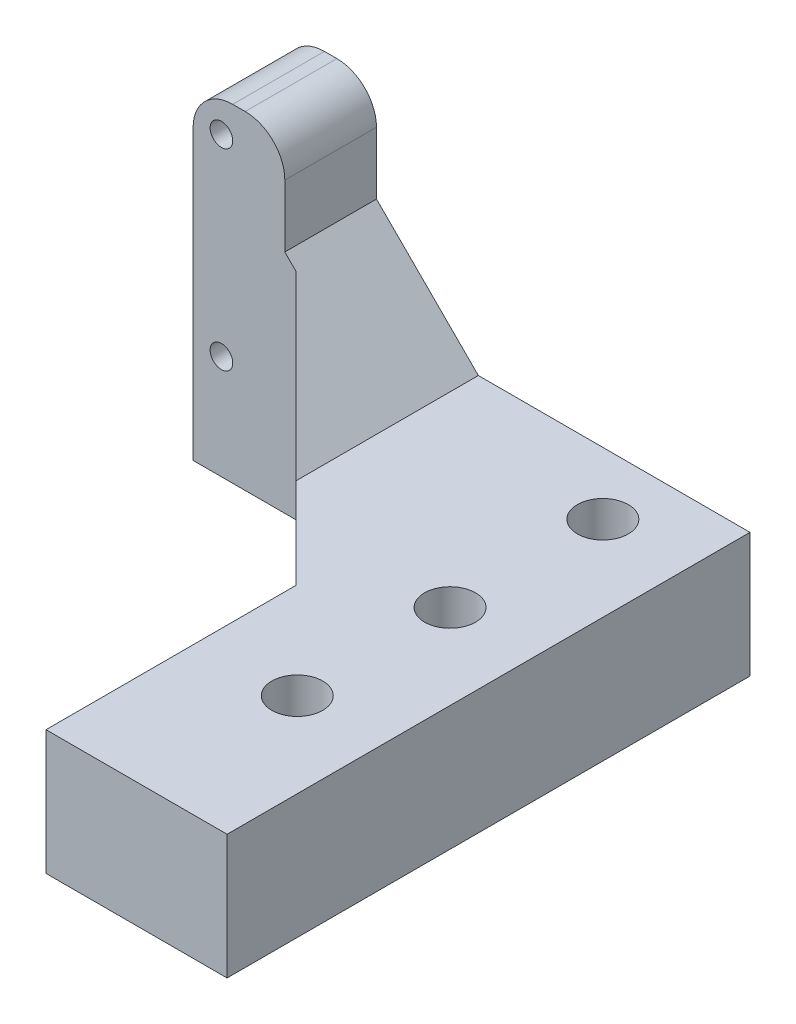
ISO-10303-21;
HEADER;
FILE_DESCRIPTION(('STEP AP214'),'2;1');
FILE_NAME('part.step','',(''),(''),'','','');
FILE_SCHEMA(('AUTOMOTIVE_DESIGN { 1 0 10303 214 1 1 1 1 }'));
ENDSEC;
DATA;
#1=APPLICATION_CONTEXT('core data for automotive mechanical design processes');
#2=APPLICATION_PROTOCOL_DEFINITION('international standard','automotive_design',2000,#1);
#3=PRODUCT_CONTEXT('',#1,'mechanical');
#4=PRODUCT('Part','Part','',(#3));
#5=PRODUCT_RELATED_PRODUCT_CATEGORY('part','',(#4));
#6=PRODUCT_DEFINITION_FORMATION('','',#4);
#7=PRODUCT_DEFINITION_CONTEXT('part definition',#1,'design');
#8=PRODUCT_DEFINITION('design','',#6,#7);
#9=PRODUCT_DEFINITION_SHAPE('','',#8);
#10=(LENGTH_UNIT() NAMED_UNIT(*) SI_UNIT(.MILLI.,.METRE.));
#11=(NAMED_UNIT(*) PLANE_ANGLE_UNIT() SI_UNIT($,.RADIAN.));
#12=(NAMED_UNIT(*) SI_UNIT($,.STERADIAN.) SOLID_ANGLE_UNIT());
#13=UNCERTAINTY_MEASURE_WITH_UNIT(LENGTH_MEASURE(1.E-05),#10,'distance_accuracy_value','');
#14=(GEOMETRIC_REPRESENTATION_CONTEXT(3) GLOBAL_UNCERTAINTY_ASSIGNED_CONTEXT((#13)) GLOBAL_UNIT_ASSIGNED_CONTEXT((#10,
#11,#12)) REPRESENTATION_CONTEXT('',''));
#15=CARTESIAN_POINT('',(0.,0.,0.));
#16=DIRECTION('',(0.,0.,1.));
#17=DIRECTION('',(1.,0.,0.));
#18=AXIS2_PLACEMENT_3D('',#15,#16,#17);
#19=CARTESIAN_POINT('',(0.,0.,46.2));
#20=DIRECTION('',(0.,1.,0.));
#21=DIRECTION('',(0.,0.,1.));
#22=AXIS2_PLACEMENT_3D('',#19,#20,#21);
#23=PLANE('',#22);
#24=DIRECTION('',(1.,0.,0.));
#25=VECTOR('',#24,1.);
#26=CARTESIAN_POINT('',(0.,0.,46.2));
#27=LINE('',#26,#25);
#28=CARTESIAN_POINT('',(25.1,0.,46.2));
#29=VERTEX_POINT('',#28);
#30=CARTESIAN_POINT('',(41.1,0.,46.2));
#31=VERTEX_POINT('',#30);
#32=EDGE_CURVE('E134',#29,#31,#27,.T.);
#33=ORIENTED_EDGE('',*,*,#32,.F.);
#34=DIRECTION('',(0.,0.,-1.));
#35=VECTOR('',#34,1.);
#36=CARTESIAN_POINT('',(25.1,0.,46.2));
#37=LINE('',#36,#35);
#38=CARTESIAN_POINT('',(25.1,0.,24.1));
#39=VERTEX_POINT('',#38);
#40=EDGE_CURVE('E120',#29,#39,#37,.T.);
#41=ORIENTED_EDGE('',*,*,#40,.T.);
#42=DIRECTION('',(0.707106781186551,0.,0.707106781186544));
#43=VECTOR('',#42,1.);
#44=CARTESIAN_POINT('',(23.5999999999999,0.,22.5999999999998));
#45=LINE('',#44,#43);
#46=CARTESIAN_POINT('',(9.09999999999989,0.,8.1));
#47=VERTEX_POINT('',#46);
#48=EDGE_CURVE('E11',#39,#47,#45,.F.);
#49=ORIENTED_EDGE('',*,*,#48,.T.);
#50=DIRECTION('',(-1.,0.,0.));
#51=VECTOR('',#50,1.);
#52=CARTESIAN_POINT('',(0.,0.,8.1));
#53=LINE('',#52,#51);
#54=CARTESIAN_POINT('',(0.,0.,8.1));
#55=VERTEX_POINT('',#54);
#56=EDGE_CURVE('E196',#47,#55,#53,.T.);
#57=ORIENTED_EDGE('',*,*,#56,.T.);
#58=DIRECTION('',(0.,0.,-1.));
#59=VECTOR('',#58,1.);
#60=CARTESIAN_POINT('',(0.,0.,46.2));
#61=LINE('',#60,#59);
#62=CARTESIAN_POINT('',(0.,0.,0.));
#63=VERTEX_POINT('',#62);
#64=EDGE_CURVE('E224',#55,#63,#61,.T.);
#65=ORIENTED_EDGE('',*,*,#64,.T.);
#66=DIRECTION('',(-1.,0.,0.));
#67=VECTOR('',#66,1.);
#68=CARTESIAN_POINT('',(18.,0.,0.));
#69=LINE('',#68,#67);
#70=CARTESIAN_POINT('',(41.1,0.,0.));
#71=VERTEX_POINT('',#70);
#72=EDGE_CURVE('E144',#71,#63,#69,.T.);
#73=ORIENTED_EDGE('',*,*,#72,.F.);
#74=DIRECTION('',(0.,0.,-1.));
#75=VECTOR('',#74,1.);
#76=CARTESIAN_POINT('',(41.1,0.,46.2));
#77=LINE('',#76,#75);
#78=EDGE_CURVE('E142',#31,#71,#77,.T.);
#79=ORIENTED_EDGE('',*,*,#78,.F.);
#80=EDGE_LOOP('',(#33,#41,#49,#57,#65,#73,#79));
#81=FACE_BOUND('',#80,.T.);
#82=CARTESIAN_POINT('',(33.6,0.,19.));
#83=DIRECTION('',(0.,1.,0.));
#84=DIRECTION('',(0.,0.,1.));
#85=AXIS2_PLACEMENT_3D('',#82,#83,#84);
#86=CIRCLE('',#85,2.25);
#87=CARTESIAN_POINT('',(33.6,0.,21.25));
#88=VERTEX_POINT('',#87);
#89=EDGE_CURVE('E328',#88,#88,#86,.T.);
#90=ORIENTED_EDGE('',*,*,#89,.T.);
#91=EDGE_LOOP('',(#90));
#92=FACE_BOUND('',#91,.T.);
#93=CARTESIAN_POINT('',(33.6,0.,32.5));
#94=DIRECTION('',(0.,1.,0.));
#95=DIRECTION('',(0.,0.,1.));
#96=AXIS2_PLACEMENT_3D('',#93,#94,#95);
#97=CIRCLE('',#96,2.25);
#98=CARTESIAN_POINT('',(33.6,0.,34.75));
#99=VERTEX_POINT('',#98);
#100=EDGE_CURVE('E336',#99,#99,#97,.T.);
#101=ORIENTED_EDGE('',*,*,#100,.T.);
#102=EDGE_LOOP('',(#101));
#103=FACE_BOUND('',#102,.T.);
#104=CARTESIAN_POINT('',(33.6,0.,5.5));
#105=DIRECTION('',(0.,1.,0.));
#106=DIRECTION('',(0.,0.,1.));
#107=AXIS2_PLACEMENT_3D('',#104,#105,#106);
#108=CIRCLE('',#107,2.25);
#109=CARTESIAN_POINT('',(33.6,0.,7.75));
#110=VERTEX_POINT('',#109);
#111=EDGE_CURVE('E295',#110,#110,#108,.T.);
#112=ORIENTED_EDGE('',*,*,#111,.T.);
#113=EDGE_LOOP('',(#112));
#114=FACE_BOUND('',#113,.T.);
#115=ADVANCED_FACE('F33',(#81,#92,#103,#114),#23,.F.);
#116=CARTESIAN_POINT('',(0.,29.,46.2));
#117=DIRECTION('',(0.,-1.,0.));
#118=DIRECTION('',(0.,0.,-1.));
#119=AXIS2_PLACEMENT_3D('',#116,#117,#118);
#120=PLANE('',#119);
#121=DIRECTION('',(-1.,0.,0.));
#122=VECTOR('',#121,1.);
#123=CARTESIAN_POINT('',(0.,29.,8.1));
#124=LINE('',#123,#122);
#125=CARTESIAN_POINT('',(4.6,29.,8.1));
#126=VERTEX_POINT('',#125);
#127=CARTESIAN_POINT('',(3.5,29.,8.1));
#128=VERTEX_POINT('',#127);
#129=EDGE_CURVE('E204',#126,#128,#124,.T.);
#130=ORIENTED_EDGE('',*,*,#129,.F.);
#131=DIRECTION('',(0.,0.,-1.));
#132=VECTOR('',#131,1.);
#133=CARTESIAN_POINT('',(4.6,29.,46.2));
#134=LINE('',#133,#132);
#135=CARTESIAN_POINT('',(4.6,29.,0.));
#136=VERTEX_POINT('',#135);
#137=EDGE_CURVE('E172',#126,#136,#134,.T.);
#138=ORIENTED_EDGE('',*,*,#137,.T.);
#139=DIRECTION('',(-1.,0.,0.));
#140=VECTOR('',#139,1.);
#141=CARTESIAN_POINT('',(18.,29.,0.));
#142=LINE('',#141,#140);
#143=CARTESIAN_POINT('',(3.5,29.,0.));
#144=VERTEX_POINT('',#143);
#145=EDGE_CURVE('E150',#136,#144,#142,.T.);
#146=ORIENTED_EDGE('',*,*,#145,.T.);
#147=DIRECTION('',(0.,0.,-1.));
#148=VECTOR('',#147,1.);
#149=CARTESIAN_POINT('',(3.5,29.,46.2));
#150=LINE('',#149,#148);
#151=EDGE_CURVE('E143',#144,#128,#150,.F.);
#152=ORIENTED_EDGE('',*,*,#151,.T.);
#153=EDGE_LOOP('',(#130,#138,#146,#152));
#154=FACE_BOUND('',#153,.T.);
#155=ADVANCED_FACE('F247',(#154),#120,.F.);
#156=CARTESIAN_POINT('',(0.,0.,46.2));
#157=DIRECTION('',(0.,0.,-1.));
#158=DIRECTION('',(-1.,0.,0.));
#159=AXIS2_PLACEMENT_3D('',#156,#157,#158);
#160=PLANE('',#159);
#161=DIRECTION('',(-1.,0.,0.));
#162=VECTOR('',#161,1.);
#163=CARTESIAN_POINT('',(26.1,11.,46.2));
#164=LINE('',#163,#162);
#165=CARTESIAN_POINT('',(41.1,11.,46.2));
#166=VERTEX_POINT('',#165);
#167=CARTESIAN_POINT('',(25.1,11.,46.2));
#168=VERTEX_POINT('',#167);
#169=EDGE_CURVE('E136',#166,#168,#164,.T.);
#170=ORIENTED_EDGE('',*,*,#169,.T.);
#171=DIRECTION('',(0.,1.,0.));
#172=VECTOR('',#171,1.);
#173=CARTESIAN_POINT('',(25.1,0.,46.2));
#174=LINE('',#173,#172);
#175=EDGE_CURVE('E123',#29,#168,#174,.T.);
#176=ORIENTED_EDGE('',*,*,#175,.F.);
#177=ORIENTED_EDGE('',*,*,#32,.T.);
#178=DIRECTION('',(0.,1.,0.));
#179=VECTOR('',#178,1.);
#180=CARTESIAN_POINT('',(41.1,0.,46.2));
#181=LINE('',#180,#179);
#182=EDGE_CURVE('E289',#31,#166,#181,.T.);
#183=ORIENTED_EDGE('',*,*,#182,.T.);
#184=EDGE_LOOP('',(#170,#176,#177,#183));
#185=FACE_BOUND('',#184,.T.);
#186=ADVANCED_FACE('F132',(#185),#160,.F.);
#187=CARTESIAN_POINT('',(18.,0.,0.));
#188=DIRECTION('',(0.,0.,-1.));
#189=DIRECTION('',(-1.,0.,0.));
#190=AXIS2_PLACEMENT_3D('',#187,#188,#189);
#191=PLANE('',#190);
#192=ORIENTED_EDGE('',*,*,#145,.F.);
#193=CARTESIAN_POINT('',(4.6,25.5,0.));
#194=DIRECTION('',(0.,0.,-1.));
#195=DIRECTION('',(-1.,0.,0.));
#196=AXIS2_PLACEMENT_3D('',#193,#194,#195);
#197=CIRCLE('',#196,3.5);
#198=CARTESIAN_POINT('',(8.1,25.5,0.));
#199=VERTEX_POINT('',#198);
#200=EDGE_CURVE('E175',#136,#199,#197,.T.);
#201=ORIENTED_EDGE('',*,*,#200,.T.);
#202=DIRECTION('',(0.,1.,0.));
#203=VECTOR('',#202,1.);
#204=CARTESIAN_POINT('',(8.1,29.,0.));
#205=LINE('',#204,#203);
#206=CARTESIAN_POINT('',(8.1,20.0000000000001,0.));
#207=VERTEX_POINT('',#206);
#208=EDGE_CURVE('E210',#207,#199,#205,.T.);
#209=ORIENTED_EDGE('',*,*,#208,.F.);
#210=DIRECTION('',(-0.707106781186544,0.707106781186551,0.));
#211=VECTOR('',#210,1.);
#212=CARTESIAN_POINT('',(8.1,20.0000000000001,0.));
#213=LINE('',#212,#211);
#214=CARTESIAN_POINT('',(17.1,11.,0.));
#215=VERTEX_POINT('',#214);
#216=EDGE_CURVE('E168',#207,#215,#213,.F.);
#217=ORIENTED_EDGE('',*,*,#216,.T.);
#218=DIRECTION('',(-1.,0.,0.));
#219=VECTOR('',#218,1.);
#220=CARTESIAN_POINT('',(26.1,11.,0.));
#221=LINE('',#220,#219);
#222=CARTESIAN_POINT('',(41.1,11.,0.));
#223=VERTEX_POINT('',#222);
#224=EDGE_CURVE('E285',#223,#215,#221,.T.);
#225=ORIENTED_EDGE('',*,*,#224,.F.);
#226=DIRECTION('',(0.,1.,0.));
#227=VECTOR('',#226,1.);
#228=CARTESIAN_POINT('',(41.1,0.,0.));
#229=LINE('',#228,#227);
#230=EDGE_CURVE('E282',#71,#223,#229,.T.);
#231=ORIENTED_EDGE('',*,*,#230,.F.);
#232=ORIENTED_EDGE('',*,*,#72,.T.);
#233=DIRECTION('',(0.,-1.,0.));
#234=VECTOR('',#233,1.);
#235=CARTESIAN_POINT('',(0.,0.,0.));
#236=LINE('',#235,#234);
#237=CARTESIAN_POINT('',(0.,25.5,0.));
#238=VERTEX_POINT('',#237);
#239=EDGE_CURVE('E222',#238,#63,#236,.T.);
#240=ORIENTED_EDGE('',*,*,#239,.F.);
#241=CARTESIAN_POINT('',(3.5,25.5,0.));
#242=DIRECTION('',(0.,0.,-1.));
#243=DIRECTION('',(-1.,0.,0.));
#244=AXIS2_PLACEMENT_3D('',#241,#242,#243);
#245=CIRCLE('',#244,3.5);
#246=EDGE_CURVE('E156',#238,#144,#245,.T.);
#247=ORIENTED_EDGE('',*,*,#246,.T.);
#248=EDGE_LOOP('',(#192,#201,#209,#217,#225,#231,#232,#240,#247));
#249=FACE_BOUND('',#248,.T.);
#250=CARTESIAN_POINT('',(2.5,9.2,0.));
#251=DIRECTION('',(0.,0.,1.));
#252=DIRECTION('',(1.,0.,0.));
#253=AXIS2_PLACEMENT_3D('',#250,#251,#252);
#254=CIRCLE('',#253,1.);
#255=CARTESIAN_POINT('',(3.5,9.2,0.));
#256=VERTEX_POINT('',#255);
#257=EDGE_CURVE('E216',#256,#256,#254,.T.);
#258=ORIENTED_EDGE('',*,*,#257,.T.);
#259=EDGE_LOOP('',(#258));
#260=FACE_BOUND('',#259,.T.);
#261=CARTESIAN_POINT('',(2.5,26.2,0.));
#262=DIRECTION('',(0.,0.,1.));
#263=DIRECTION('',(1.,0.,0.));
#264=AXIS2_PLACEMENT_3D('',#261,#262,#263);
#265=CIRCLE('',#264,1.);
#266=CARTESIAN_POINT('',(3.5,26.2,0.));
#267=VERTEX_POINT('',#266);
#268=EDGE_CURVE('E219',#267,#267,#265,.T.);
#269=ORIENTED_EDGE('',*,*,#268,.T.);
#270=EDGE_LOOP('',(#269));
#271=FACE_BOUND('',#270,.T.);
#272=ADVANCED_FACE('F283',(#249,#260,#271),#191,.T.);
#273=CARTESIAN_POINT('',(0.,0.,46.2));
#274=DIRECTION('',(1.,0.,0.));
#275=DIRECTION('',(0.,0.,-1.));
#276=AXIS2_PLACEMENT_3D('',#273,#274,#275);
#277=PLANE('',#276);
#278=DIRECTION('',(0.,1.,0.));
#279=VECTOR('',#278,1.);
#280=CARTESIAN_POINT('',(0.,0.,8.1));
#281=LINE('',#280,#279);
#282=CARTESIAN_POINT('',(0.,25.5,8.1));
#283=VERTEX_POINT('',#282);
#284=EDGE_CURVE('E202',#55,#283,#281,.T.);
#285=ORIENTED_EDGE('',*,*,#284,.T.);
#286=DIRECTION('',(0.,0.,-1.));
#287=VECTOR('',#286,1.);
#288=CARTESIAN_POINT('',(0.,25.5,46.2));
#289=LINE('',#288,#287);
#290=EDGE_CURVE('E147',#283,#238,#289,.T.);
#291=ORIENTED_EDGE('',*,*,#290,.T.);
#292=ORIENTED_EDGE('',*,*,#239,.T.);
#293=ORIENTED_EDGE('',*,*,#64,.F.);
#294=EDGE_LOOP('',(#285,#291,#292,#293));
#295=FACE_BOUND('',#294,.T.);
#296=ADVANCED_FACE('F277',(#295),#277,.F.);
#297=CARTESIAN_POINT('',(2.5,26.2,0.));
#298=DIRECTION('',(0.,0.,1.));
#299=DIRECTION('',(1.,0.,0.));
#300=AXIS2_PLACEMENT_3D('',#297,#298,#299);
#301=CYLINDRICAL_SURFACE('',#300,1.);
#302=CARTESIAN_POINT('',(2.5,26.2,8.1));
#303=DIRECTION('',(0.,0.,-1.));
#304=DIRECTION('',(-1.,0.,0.));
#305=AXIS2_PLACEMENT_3D('',#302,#303,#304);
#306=CIRCLE('',#305,1.);
#307=CARTESIAN_POINT('',(1.5,26.2,8.1));
#308=VERTEX_POINT('',#307);
#309=EDGE_CURVE('E213',#308,#308,#306,.F.);
#310=ORIENTED_EDGE('',*,*,#309,.T.);
#311=EDGE_LOOP('',(#310));
#312=FACE_BOUND('',#311,.T.);
#313=ORIENTED_EDGE('',*,*,#268,.F.);
#314=EDGE_LOOP('',(#313));
#315=FACE_BOUND('',#314,.T.);
#316=ADVANCED_FACE('F244',(#312,#315),#301,.F.);
#317=CARTESIAN_POINT('',(2.5,9.2,0.));
#318=DIRECTION('',(0.,0.,1.));
#319=DIRECTION('',(1.,0.,0.));
#320=AXIS2_PLACEMENT_3D('',#317,#318,#319);
#321=CYLINDRICAL_SURFACE('',#320,1.);
#322=CARTESIAN_POINT('',(2.5,9.2,8.1));
#323=DIRECTION('',(0.,0.,-1.));
#324=DIRECTION('',(-1.,0.,0.));
#325=AXIS2_PLACEMENT_3D('',#322,#323,#324);
#326=CIRCLE('',#325,1.);
#327=CARTESIAN_POINT('',(1.5,9.2,8.1));
#328=VERTEX_POINT('',#327);
#329=EDGE_CURVE('E206',#328,#328,#326,.F.);
#330=ORIENTED_EDGE('',*,*,#329,.T.);
#331=EDGE_LOOP('',(#330));
#332=FACE_BOUND('',#331,.T.);
#333=ORIENTED_EDGE('',*,*,#257,.F.);
#334=EDGE_LOOP('',(#333));
#335=FACE_BOUND('',#334,.T.);
#336=ADVANCED_FACE('F229',(#332,#335),#321,.F.);
#337=CARTESIAN_POINT('',(0.,0.,8.1));
#338=DIRECTION('',(0.,0.,-1.));
#339=DIRECTION('',(-1.,0.,0.));
#340=AXIS2_PLACEMENT_3D('',#337,#338,#339);
#341=PLANE('',#340);
#342=ORIENTED_EDGE('',*,*,#329,.F.);
#343=EDGE_LOOP('',(#342));
#344=FACE_BOUND('',#343,.T.);
#345=ORIENTED_EDGE('',*,*,#56,.F.);
#346=DIRECTION('',(0.,1.,0.));
#347=VECTOR('',#346,1.);
#348=CARTESIAN_POINT('',(9.09999999999989,11.,8.1));
#349=LINE('',#348,#347);
#350=CARTESIAN_POINT('',(9.09999999999989,19.0000000000002,8.1));
#351=VERTEX_POINT('',#350);
#352=EDGE_CURVE('E183',#47,#351,#349,.T.);
#353=ORIENTED_EDGE('',*,*,#352,.T.);
#354=DIRECTION('',(0.707106781186544,-0.707106781186551,0.));
#355=VECTOR('',#354,1.);
#356=CARTESIAN_POINT('',(14.0500000000001,14.0499999999999,8.1));
#357=LINE('',#356,#355);
#358=CARTESIAN_POINT('',(8.1,20.0000000000001,8.1));
#359=VERTEX_POINT('',#358);
#360=EDGE_CURVE('E170',#351,#359,#357,.F.);
#361=ORIENTED_EDGE('',*,*,#360,.T.);
#362=DIRECTION('',(0.,1.,0.));
#363=VECTOR('',#362,1.);
#364=CARTESIAN_POINT('',(8.1,0.,8.1));
#365=LINE('',#364,#363);
#366=CARTESIAN_POINT('',(8.1,25.5,8.1));
#367=VERTEX_POINT('',#366);
#368=EDGE_CURVE('E161',#359,#367,#365,.T.);
#369=ORIENTED_EDGE('',*,*,#368,.T.);
#370=CARTESIAN_POINT('',(4.6,25.5,8.1));
#371=DIRECTION('',(0.,0.,-1.));
#372=DIRECTION('',(-1.,0.,0.));
#373=AXIS2_PLACEMENT_3D('',#370,#371,#372);
#374=CIRCLE('',#373,3.5);
#375=EDGE_CURVE('E179',#367,#126,#374,.F.);
#376=ORIENTED_EDGE('',*,*,#375,.T.);
#377=ORIENTED_EDGE('',*,*,#129,.T.);
#378=CARTESIAN_POINT('',(3.5,25.5,8.1));
#379=DIRECTION('',(0.,0.,-1.));
#380=DIRECTION('',(-1.,0.,0.));
#381=AXIS2_PLACEMENT_3D('',#378,#379,#380);
#382=CIRCLE('',#381,3.5);
#383=EDGE_CURVE('E159',#128,#283,#382,.F.);
#384=ORIENTED_EDGE('',*,*,#383,.T.);
#385=ORIENTED_EDGE('',*,*,#284,.F.);
#386=EDGE_LOOP('',(#345,#353,#361,#369,#376,#377,#384,#385));
#387=FACE_BOUND('',#386,.T.);
#388=ORIENTED_EDGE('',*,*,#309,.F.);
#389=EDGE_LOOP('',(#388));
#390=FACE_BOUND('',#389,.T.);
#391=ADVANCED_FACE('F199',(#344,#387,#390),#341,.F.);
#392=CARTESIAN_POINT('',(3.5,25.5,46.2));
#393=DIRECTION('',(0.,0.,-1.));
#394=DIRECTION('',(-1.,0.,0.));
#395=AXIS2_PLACEMENT_3D('',#392,#393,#394);
#396=CYLINDRICAL_SURFACE('',#395,3.5);
#397=ORIENTED_EDGE('',*,*,#383,.F.);
#398=ORIENTED_EDGE('',*,*,#151,.F.);
#399=ORIENTED_EDGE('',*,*,#246,.F.);
#400=ORIENTED_EDGE('',*,*,#290,.F.);
#401=EDGE_LOOP('',(#397,#398,#399,#400));
#402=FACE_BOUND('',#401,.T.);
#403=ADVANCED_FACE('F233',(#402),#396,.T.);
#404=CARTESIAN_POINT('',(8.1,29.,46.2));
#405=DIRECTION('',(-1.,0.,0.));
#406=DIRECTION('',(0.,-1.,0.));
#407=AXIS2_PLACEMENT_3D('',#404,#405,#406);
#408=PLANE('',#407);
#409=ORIENTED_EDGE('',*,*,#208,.T.);
#410=DIRECTION('',(0.,0.,-1.));
#411=VECTOR('',#410,1.);
#412=CARTESIAN_POINT('',(8.1,25.5,46.2));
#413=LINE('',#412,#411);
#414=EDGE_CURVE('E177',#199,#367,#413,.F.);
#415=ORIENTED_EDGE('',*,*,#414,.T.);
#416=ORIENTED_EDGE('',*,*,#368,.F.);
#417=DIRECTION('',(0.,0.,-1.));
#418=VECTOR('',#417,1.);
#419=CARTESIAN_POINT('',(8.1,20.0000000000001,0.));
#420=LINE('',#419,#418);
#421=EDGE_CURVE('E165',#359,#207,#420,.T.);
#422=ORIENTED_EDGE('',*,*,#421,.T.);
#423=EDGE_LOOP('',(#409,#415,#416,#422));
#424=FACE_BOUND('',#423,.T.);
#425=ADVANCED_FACE('F240',(#424),#408,.F.);
#426=CARTESIAN_POINT('',(26.1,11.,46.2));
#427=DIRECTION('',(0.,-1.,0.));
#428=DIRECTION('',(0.,0.,-1.));
#429=AXIS2_PLACEMENT_3D('',#426,#427,#428);
#430=PLANE('',#429);
#431=DIRECTION('',(0.,0.,1.));
#432=VECTOR('',#431,1.);
#433=CARTESIAN_POINT('',(17.1,11.,8.1));
#434=LINE('',#433,#432);
#435=CARTESIAN_POINT('',(17.1,11.,16.1));
#436=VERTEX_POINT('',#435);
#437=EDGE_CURVE('E48',#215,#436,#434,.T.);
#438=ORIENTED_EDGE('',*,*,#437,.T.);
#439=DIRECTION('',(-0.707106781186551,0.,-0.707106781186544));
#440=VECTOR('',#439,1.);
#441=CARTESIAN_POINT('',(36.65,11.,35.6499999999998));
#442=LINE('',#441,#440);
#443=CARTESIAN_POINT('',(25.1,11.,24.1));
#444=VERTEX_POINT('',#443);
#445=EDGE_CURVE('E41',#436,#444,#442,.F.);
#446=ORIENTED_EDGE('',*,*,#445,.T.);
#447=DIRECTION('',(0.,0.,1.));
#448=VECTOR('',#447,1.);
#449=CARTESIAN_POINT('',(25.1,11.,46.2));
#450=LINE('',#449,#448);
#451=EDGE_CURVE('E181',#444,#168,#450,.T.);
#452=ORIENTED_EDGE('',*,*,#451,.T.);
#453=ORIENTED_EDGE('',*,*,#169,.F.);
#454=DIRECTION('',(0.,0.,-1.));
#455=VECTOR('',#454,1.);
#456=CARTESIAN_POINT('',(41.1,11.,46.2));
#457=LINE('',#456,#455);
#458=EDGE_CURVE('E292',#166,#223,#457,.T.);
#459=ORIENTED_EDGE('',*,*,#458,.T.);
#460=ORIENTED_EDGE('',*,*,#224,.T.);
#461=EDGE_LOOP('',(#438,#446,#452,#453,#459,#460));
#462=FACE_BOUND('',#461,.T.);
#463=CARTESIAN_POINT('',(33.6,11.,19.));
#464=DIRECTION('',(0.,1.,0.));
#465=DIRECTION('',(0.,0.,1.));
#466=AXIS2_PLACEMENT_3D('',#463,#464,#465);
#467=CIRCLE('',#466,2.25);
#468=CARTESIAN_POINT('',(33.6,11.,21.25));
#469=VERTEX_POINT('',#468);
#470=EDGE_CURVE('E137',#469,#469,#467,.T.);
#471=ORIENTED_EDGE('',*,*,#470,.F.);
#472=EDGE_LOOP('',(#471));
#473=FACE_BOUND('',#472,.T.);
#474=CARTESIAN_POINT('',(33.6,11.,32.5));
#475=DIRECTION('',(0.,1.,0.));
#476=DIRECTION('',(0.,0.,1.));
#477=AXIS2_PLACEMENT_3D('',#474,#475,#476);
#478=CIRCLE('',#477,2.25);
#479=CARTESIAN_POINT('',(33.6,11.,34.75));
#480=VERTEX_POINT('',#479);
#481=EDGE_CURVE('E333',#480,#480,#478,.T.);
#482=ORIENTED_EDGE('',*,*,#481,.F.);
#483=EDGE_LOOP('',(#482));
#484=FACE_BOUND('',#483,.T.);
#485=CARTESIAN_POINT('',(33.6,11.,5.5));
#486=DIRECTION('',(0.,1.,0.));
#487=DIRECTION('',(0.,0.,1.));
#488=AXIS2_PLACEMENT_3D('',#485,#486,#487);
#489=CIRCLE('',#488,2.25);
#490=CARTESIAN_POINT('',(33.6,11.,7.75));
#491=VERTEX_POINT('',#490);
#492=EDGE_CURVE('E298',#491,#491,#489,.T.);
#493=ORIENTED_EDGE('',*,*,#492,.F.);
#494=EDGE_LOOP('',(#493));
#495=FACE_BOUND('',#494,.T.);
#496=ADVANCED_FACE('F305',(#462,#473,#484,#495),#430,.F.);
#497=CARTESIAN_POINT('',(41.1,0.,46.2));
#498=DIRECTION('',(1.,0.,0.));
#499=DIRECTION('',(0.,0.,-1.));
#500=AXIS2_PLACEMENT_3D('',#497,#498,#499);
#501=PLANE('',#500);
#502=ORIENTED_EDGE('',*,*,#458,.F.);
#503=ORIENTED_EDGE('',*,*,#182,.F.);
#504=ORIENTED_EDGE('',*,*,#78,.T.);
#505=ORIENTED_EDGE('',*,*,#230,.T.);
#506=EDGE_LOOP('',(#502,#503,#504,#505));
#507=FACE_BOUND('',#506,.T.);
#508=ADVANCED_FACE('F291',(#507),#501,.T.);
#509=CARTESIAN_POINT('',(33.6,0.,5.5));
#510=DIRECTION('',(0.,1.,0.));
#511=DIRECTION('',(0.,0.,1.));
#512=AXIS2_PLACEMENT_3D('',#509,#510,#511);
#513=CYLINDRICAL_SURFACE('',#512,2.25);
#514=ORIENTED_EDGE('',*,*,#111,.F.);
#515=EDGE_LOOP('',(#514));
#516=FACE_BOUND('',#515,.T.);
#517=ORIENTED_EDGE('',*,*,#492,.T.);
#518=EDGE_LOOP('',(#517));
#519=FACE_BOUND('',#518,.T.);
#520=ADVANCED_FACE('F313',(#516,#519),#513,.F.);
#521=CARTESIAN_POINT('',(33.6,0.,32.5));
#522=DIRECTION('',(0.,1.,0.));
#523=DIRECTION('',(0.,0.,1.));
#524=AXIS2_PLACEMENT_3D('',#521,#522,#523);
#525=CYLINDRICAL_SURFACE('',#524,2.25);
#526=ORIENTED_EDGE('',*,*,#100,.F.);
#527=EDGE_LOOP('',(#526));
#528=FACE_BOUND('',#527,.T.);
#529=ORIENTED_EDGE('',*,*,#481,.T.);
#530=EDGE_LOOP('',(#529));
#531=FACE_BOUND('',#530,.T.);
#532=ADVANCED_FACE('F316',(#528,#531),#525,.F.);
#533=CARTESIAN_POINT('',(33.6,0.,19.));
#534=DIRECTION('',(0.,1.,0.));
#535=DIRECTION('',(0.,0.,1.));
#536=AXIS2_PLACEMENT_3D('',#533,#534,#535);
#537=CYLINDRICAL_SURFACE('',#536,2.25);
#538=ORIENTED_EDGE('',*,*,#89,.F.);
#539=EDGE_LOOP('',(#538));
#540=FACE_BOUND('',#539,.T.);
#541=ORIENTED_EDGE('',*,*,#470,.T.);
#542=EDGE_LOOP('',(#541));
#543=FACE_BOUND('',#542,.T.);
#544=ADVANCED_FACE('F259',(#540,#543),#537,.F.);
#545=CARTESIAN_POINT('',(8.1,20.0000000000001,46.2));
#546=DIRECTION('',(0.707106781186551,0.707106781186544,0.));
#547=DIRECTION('',(0.,0.,1.));
#548=AXIS2_PLACEMENT_3D('',#545,#546,#547);
#549=PLANE('',#548);
#550=ORIENTED_EDGE('',*,*,#360,.F.);
#551=DIRECTION('',(0.577350269189626,-0.577350269189632,0.577350269189619));
#552=VECTOR('',#551,1.);
#553=CARTESIAN_POINT('',(21.1333333333332,6.96666666666677,20.1333333333331));
#554=LINE('',#553,#552);
#555=EDGE_CURVE('E187',#351,#436,#554,.T.);
#556=ORIENTED_EDGE('',*,*,#555,.T.);
#557=ORIENTED_EDGE('',*,*,#437,.F.);
#558=ORIENTED_EDGE('',*,*,#216,.F.);
#559=ORIENTED_EDGE('',*,*,#421,.F.);
#560=EDGE_LOOP('',(#550,#556,#557,#558,#559));
#561=FACE_BOUND('',#560,.T.);
#562=ADVANCED_FACE('F190',(#561),#549,.T.);
#563=CARTESIAN_POINT('',(4.6,25.5,46.2));
#564=DIRECTION('',(0.,0.,-1.));
#565=DIRECTION('',(-1.,0.,0.));
#566=AXIS2_PLACEMENT_3D('',#563,#564,#565);
#567=CYLINDRICAL_SURFACE('',#566,3.5);
#568=ORIENTED_EDGE('',*,*,#375,.F.);
#569=ORIENTED_EDGE('',*,*,#414,.F.);
#570=ORIENTED_EDGE('',*,*,#200,.F.);
#571=ORIENTED_EDGE('',*,*,#137,.F.);
#572=EDGE_LOOP('',(#568,#569,#570,#571));
#573=FACE_BOUND('',#572,.T.);
#574=ADVANCED_FACE('F258',(#573),#567,.T.);
#575=CARTESIAN_POINT('',(25.1,0.,46.2));
#576=DIRECTION('',(1.,0.,0.));
#577=DIRECTION('',(0.,0.,-1.));
#578=AXIS2_PLACEMENT_3D('',#575,#576,#577);
#579=PLANE('',#578);
#580=ORIENTED_EDGE('',*,*,#451,.F.);
#581=DIRECTION('',(0.,-1.,0.));
#582=VECTOR('',#581,1.);
#583=CARTESIAN_POINT('',(25.1,0.,24.1));
#584=LINE('',#583,#582);
#585=EDGE_CURVE('E126',#444,#39,#584,.T.);
#586=ORIENTED_EDGE('',*,*,#585,.T.);
#587=ORIENTED_EDGE('',*,*,#40,.F.);
#588=ORIENTED_EDGE('',*,*,#175,.T.);
#589=EDGE_LOOP('',(#580,#586,#587,#588));
#590=FACE_BOUND('',#589,.T.);
#591=ADVANCED_FACE('F122',(#590),#579,.F.);
#592=CARTESIAN_POINT('',(9.09999999999989,0.,8.1));
#593=DIRECTION('',(-0.707106781186544,0.,0.707106781186551));
#594=DIRECTION('',(0.,-1.,0.));
#595=AXIS2_PLACEMENT_3D('',#592,#593,#594);
#596=PLANE('',#595);
#597=ORIENTED_EDGE('',*,*,#48,.F.);
#598=ORIENTED_EDGE('',*,*,#585,.F.);
#599=ORIENTED_EDGE('',*,*,#445,.F.);
#600=ORIENTED_EDGE('',*,*,#555,.F.);
#601=ORIENTED_EDGE('',*,*,#352,.F.);
#602=EDGE_LOOP('',(#597,#598,#599,#600,#601));
#603=FACE_BOUND('',#602,.T.);
#604=ADVANCED_FACE('F35',(#603),#596,.T.);
#605=CLOSED_SHELL('',(#115,#155,#186,#272,#296,#316,#336,#391,#403,#425,#496,#508,#520,#532,
#544,#562,#574,#591,#604));
#606=MANIFOLD_SOLID_BREP('B2',#605);
#607=ADVANCED_BREP_SHAPE_REPRESENTATION('',(#18,#606),#14);
#608=SHAPE_DEFINITION_REPRESENTATION(#9,#607);
ENDSEC;
END-ISO-10303-21;
